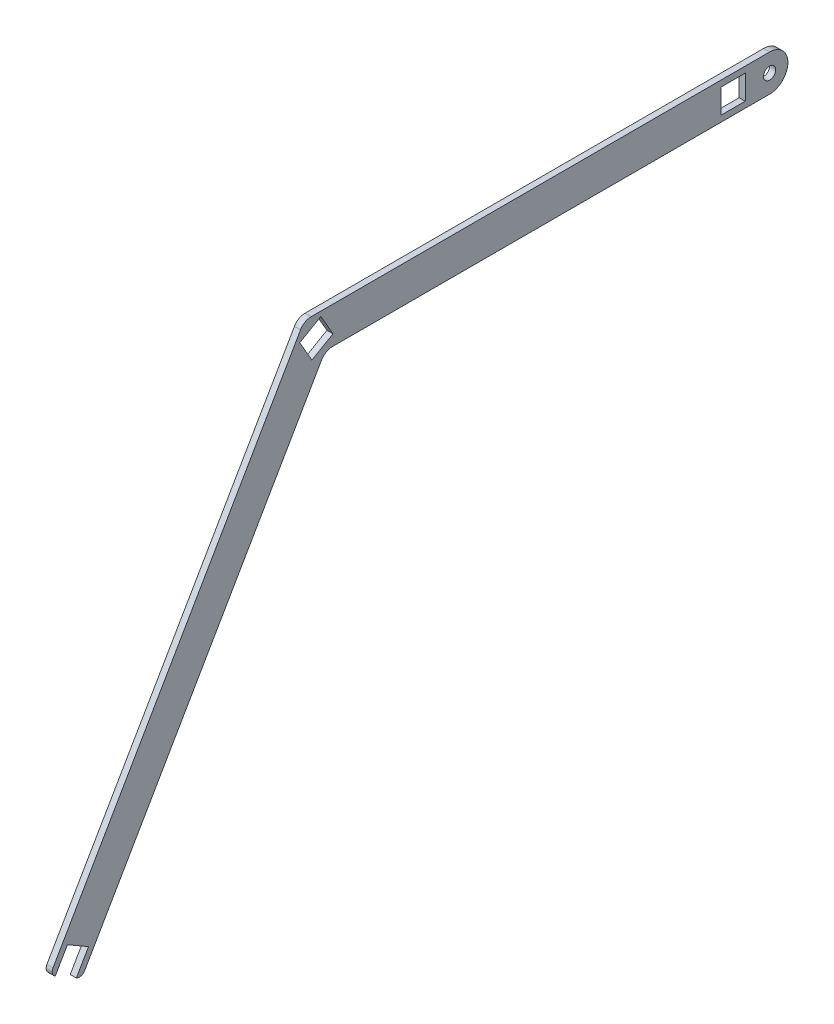
ISO-10303-21;
HEADER;
FILE_DESCRIPTION(('STEP AP214'),'2;1');
FILE_NAME('part.step','',(''),(''),'','','');
FILE_SCHEMA(('AUTOMOTIVE_DESIGN { 1 0 10303 214 1 1 1 1 }'));
ENDSEC;
DATA;
#1=APPLICATION_CONTEXT('core data for automotive mechanical design processes');
#2=APPLICATION_PROTOCOL_DEFINITION('international standard','automotive_design',2000,#1);
#3=PRODUCT_CONTEXT('',#1,'mechanical');
#4=PRODUCT('Part','Part','',(#3));
#5=PRODUCT_RELATED_PRODUCT_CATEGORY('part','',(#4));
#6=PRODUCT_DEFINITION_FORMATION('','',#4);
#7=PRODUCT_DEFINITION_CONTEXT('part definition',#1,'design');
#8=PRODUCT_DEFINITION('design','',#6,#7);
#9=PRODUCT_DEFINITION_SHAPE('','',#8);
#10=(LENGTH_UNIT() NAMED_UNIT(*) SI_UNIT(.MILLI.,.METRE.));
#11=(NAMED_UNIT(*) PLANE_ANGLE_UNIT() SI_UNIT($,.RADIAN.));
#12=(NAMED_UNIT(*) SI_UNIT($,.STERADIAN.) SOLID_ANGLE_UNIT());
#13=UNCERTAINTY_MEASURE_WITH_UNIT(LENGTH_MEASURE(1.E-05),#10,'distance_accuracy_value','');
#14=(GEOMETRIC_REPRESENTATION_CONTEXT(3) GLOBAL_UNCERTAINTY_ASSIGNED_CONTEXT((#13)) GLOBAL_UNIT_ASSIGNED_CONTEXT((#10,
#11,#12)) REPRESENTATION_CONTEXT('',''));
#15=CARTESIAN_POINT('',(0.,0.,0.));
#16=DIRECTION('',(0.,0.,1.));
#17=DIRECTION('',(1.,0.,0.));
#18=AXIS2_PLACEMENT_3D('',#15,#16,#17);
#19=CARTESIAN_POINT('',(10.,0.,0.));
#20=DIRECTION('',(-1.,0.,0.));
#21=DIRECTION('',(0.,0.,1.));
#22=AXIS2_PLACEMENT_3D('',#19,#20,#21);
#23=PLANE('',#22);
#24=DIRECTION('',(0.,1.,0.));
#25=VECTOR('',#24,1.);
#26=CARTESIAN_POINT('',(10.,20.,40.));
#27=LINE('',#26,#25);
#28=CARTESIAN_POINT('',(10.,-20.,40.));
#29=VERTEX_POINT('',#28);
#30=CARTESIAN_POINT('',(10.,20.,40.));
#31=VERTEX_POINT('',#30);
#32=EDGE_CURVE('E211',#29,#31,#27,.T.);
#33=ORIENTED_EDGE('',*,*,#32,.F.);
#34=DIRECTION('',(0.,0.,-1.));
#35=VECTOR('',#34,1.);
#36=CARTESIAN_POINT('',(10.,-20.,40.));
#37=LINE('',#36,#35);
#38=CARTESIAN_POINT('',(10.,-20.,80.));
#39=VERTEX_POINT('',#38);
#40=EDGE_CURVE('E219',#39,#29,#37,.T.);
#41=ORIENTED_EDGE('',*,*,#40,.F.);
#42=DIRECTION('',(0.,-1.,0.));
#43=VECTOR('',#42,1.);
#44=CARTESIAN_POINT('',(10.,20.,80.));
#45=LINE('',#44,#43);
#46=CARTESIAN_POINT('',(10.,20.,80.));
#47=VERTEX_POINT('',#46);
#48=EDGE_CURVE('E216',#47,#39,#45,.T.);
#49=ORIENTED_EDGE('',*,*,#48,.F.);
#50=DIRECTION('',(0.,0.,1.));
#51=VECTOR('',#50,1.);
#52=CARTESIAN_POINT('',(10.,20.,40.));
#53=LINE('',#52,#51);
#54=EDGE_CURVE('E213',#31,#47,#53,.T.);
#55=ORIENTED_EDGE('',*,*,#54,.F.);
#56=EDGE_LOOP('',(#33,#41,#49,#55));
#57=FACE_BOUND('',#56,.T.);
#58=DIRECTION('',(0.,0.,1.));
#59=VECTOR('',#58,1.);
#60=CARTESIAN_POINT('',(10.,30.,0.));
#61=LINE('',#60,#59);
#62=CARTESIAN_POINT('',(10.,30.,0.));
#63=VERTEX_POINT('',#62);
#64=CARTESIAN_POINT('',(10.,29.9999999999999,753.094010767585));
#65=VERTEX_POINT('',#64);
#66=EDGE_CURVE('E251',#63,#65,#61,.T.);
#67=ORIENTED_EDGE('',*,*,#66,.T.);
#68=CARTESIAN_POINT('',(10.,9.9999999999999,753.094010767585));
#69=DIRECTION('',(-1.,0.,0.));
#70=DIRECTION('',(0.,0.,1.));
#71=AXIS2_PLACEMENT_3D('',#68,#69,#70);
#72=CIRCLE('',#71,20.);
#73=CARTESIAN_POINT('',(10.,19.9999999999999,770.414518843274));
#74=VERTEX_POINT('',#73);
#75=EDGE_CURVE('E327',#65,#74,#72,.F.);
#76=ORIENTED_EDGE('',*,*,#75,.T.);
#77=DIRECTION('',(0.,-0.86602540378444,0.499999999999998));
#78=VECTOR('',#77,1.);
#79=CARTESIAN_POINT('',(10.,29.9999999999999,764.641016151378));
#80=LINE('',#79,#78);
#81=CARTESIAN_POINT('',(10.,-684.160068989707,1176.96152422706));
#82=VERTEX_POINT('',#81);
#83=EDGE_CURVE('E254',#74,#82,#80,.T.);
#84=ORIENTED_EDGE('',*,*,#83,.T.);
#85=CARTESIAN_POINT('',(10.,-689.160068989707,1168.30127018922));
#86=DIRECTION('',(-1.,0.,0.));
#87=DIRECTION('',(0.,0.,1.));
#88=AXIS2_PLACEMENT_3D('',#85,#86,#87);
#89=CIRCLE('',#88,10.);
#90=CARTESIAN_POINT('',(10.,-697.820323027552,1173.30127018922));
#91=VERTEX_POINT('',#90);
#92=EDGE_CURVE('E312',#82,#91,#89,.F.);
#93=ORIENTED_EDGE('',*,*,#92,.T.);
#94=DIRECTION('',(0.,0.866025403784439,-0.499999999999999));
#95=VECTOR('',#94,1.);
#96=CARTESIAN_POINT('',(10.,-697.820323027552,1173.30127018922));
#97=LINE('',#96,#95);
#98=CARTESIAN_POINT('',(10.,-663.179306876175,1153.30127018922));
#99=VERTEX_POINT('',#98);
#100=EDGE_CURVE('E256',#91,#99,#97,.T.);
#101=ORIENTED_EDGE('',*,*,#100,.T.);
#102=DIRECTION('',(0.,-0.500000000000005,-0.866025403784436));
#103=VECTOR('',#102,1.);
#104=CARTESIAN_POINT('',(10.,-663.179306876175,1153.30127018922));
#105=LINE('',#104,#103);
#106=CARTESIAN_POINT('',(10.,-683.179306876175,1118.66025403784));
#107=VERTEX_POINT('',#106);
#108=EDGE_CURVE('E258',#99,#107,#105,.T.);
#109=ORIENTED_EDGE('',*,*,#108,.T.);
#110=DIRECTION('',(0.,-0.866025403784438,0.5));
#111=VECTOR('',#110,1.);
#112=CARTESIAN_POINT('',(10.,-683.179306876175,1118.66025403784));
#113=LINE('',#112,#111);
#114=CARTESIAN_POINT('',(10.,-717.820323027552,1138.66025403784));
#115=VERTEX_POINT('',#114);
#116=EDGE_CURVE('E260',#107,#115,#113,.T.);
#117=ORIENTED_EDGE('',*,*,#116,.T.);
#118=CARTESIAN_POINT('',(10.,-709.160068989707,1133.66025403784));
#119=DIRECTION('',(-1.,0.,0.));
#120=DIRECTION('',(0.,0.,1.));
#121=AXIS2_PLACEMENT_3D('',#118,#119,#120);
#122=CIRCLE('',#121,10.);
#123=CARTESIAN_POINT('',(10.,-714.160068989707,1125.));
#124=VERTEX_POINT('',#123);
#125=EDGE_CURVE('E310',#115,#124,#122,.F.);
#126=ORIENTED_EDGE('',*,*,#125,.T.);
#127=DIRECTION('',(0.,0.86602540378444,-0.499999999999998));
#128=VECTOR('',#127,1.);
#129=CARTESIAN_POINT('',(10.,-722.820323027552,1130.));
#130=LINE('',#129,#128);
#131=CARTESIAN_POINT('',(10.,-39.9999999999998,735.773502691896));
#132=VERTEX_POINT('',#131);
#133=EDGE_CURVE('E262',#124,#132,#130,.T.);
#134=ORIENTED_EDGE('',*,*,#133,.T.);
#135=CARTESIAN_POINT('',(10.,-50.,718.452994616207));
#136=DIRECTION('',(-1.,0.,0.));
#137=DIRECTION('',(0.,0.,1.));
#138=AXIS2_PLACEMENT_3D('',#135,#136,#137);
#139=CIRCLE('',#138,20.);
#140=CARTESIAN_POINT('',(10.,-30.,718.452994616207));
#141=VERTEX_POINT('',#140);
#142=EDGE_CURVE('E11',#132,#141,#139,.T.);
#143=ORIENTED_EDGE('',*,*,#142,.T.);
#144=DIRECTION('',(0.,0.,-1.));
#145=VECTOR('',#144,1.);
#146=CARTESIAN_POINT('',(10.,-30.,730.));
#147=LINE('',#146,#145);
#148=CARTESIAN_POINT('',(10.,-30.,0.));
#149=VERTEX_POINT('',#148);
#150=EDGE_CURVE('E265',#141,#149,#147,.T.);
#151=ORIENTED_EDGE('',*,*,#150,.T.);
#152=CARTESIAN_POINT('',(10.,0.,0.));
#153=DIRECTION('',(1.,0.,0.));
#154=DIRECTION('',(0.,0.,1.));
#155=AXIS2_PLACEMENT_3D('',#152,#153,#154);
#156=CIRCLE('',#155,30.);
#157=EDGE_CURVE('E248',#149,#63,#156,.T.);
#158=ORIENTED_EDGE('',*,*,#157,.T.);
#159=EDGE_LOOP('',(#67,#76,#84,#93,#101,#109,#117,#126,#134,#143,#151,#158));
#160=FACE_BOUND('',#159,.T.);
#161=CARTESIAN_POINT('',(10.,0.,0.));
#162=DIRECTION('',(1.,0.,0.));
#163=DIRECTION('',(0.,0.,-1.));
#164=AXIS2_PLACEMENT_3D('',#161,#162,#163);
#165=CIRCLE('',#164,10.);
#166=CARTESIAN_POINT('',(10.,0.,-10.));
#167=VERTEX_POINT('',#166);
#168=EDGE_CURVE('E242',#167,#167,#165,.T.);
#169=ORIENTED_EDGE('',*,*,#168,.F.);
#170=EDGE_LOOP('',(#169));
#171=FACE_BOUND('',#170,.T.);
#172=DIRECTION('',(0.,-0.866025403784437,-0.500000000000004));
#173=VECTOR('',#172,1.);
#174=CARTESIAN_POINT('',(10.,2.32050807569054,771.754264805431));
#175=LINE('',#174,#173);
#176=CARTESIAN_POINT('',(10.,2.32050807569054,771.754264805431));
#177=VERTEX_POINT('',#176);
#178=CARTESIAN_POINT('',(10.,-32.3205080756869,751.754264805431));
#179=VERTEX_POINT('',#178);
#180=EDGE_CURVE('E170',#177,#179,#175,.T.);
#181=ORIENTED_EDGE('',*,*,#180,.F.);
#182=DIRECTION('',(0.,-0.500000000000004,0.866025403784436));
#183=VECTOR('',#182,1.);
#184=CARTESIAN_POINT('',(10.,22.3205080756907,737.113248654053));
#185=LINE('',#184,#183);
#186=CARTESIAN_POINT('',(10.,22.3205080756907,737.113248654053));
#187=VERTEX_POINT('',#186);
#188=EDGE_CURVE('E195',#187,#177,#185,.T.);
#189=ORIENTED_EDGE('',*,*,#188,.F.);
#190=DIRECTION('',(0.,0.866025403784437,0.500000000000003));
#191=VECTOR('',#190,1.);
#192=CARTESIAN_POINT('',(10.,-12.3205080756868,717.113248654053));
#193=LINE('',#192,#191);
#194=CARTESIAN_POINT('',(10.,-12.3205080756868,717.113248654053));
#195=VERTEX_POINT('',#194);
#196=EDGE_CURVE('E193',#195,#187,#193,.T.);
#197=ORIENTED_EDGE('',*,*,#196,.F.);
#198=DIRECTION('',(0.,0.500000000000004,-0.866025403784436));
#199=VECTOR('',#198,1.);
#200=CARTESIAN_POINT('',(10.,-32.3205080756869,751.754264805431));
#201=LINE('',#200,#199);
#202=EDGE_CURVE('E180',#179,#195,#201,.T.);
#203=ORIENTED_EDGE('',*,*,#202,.F.);
#204=EDGE_LOOP('',(#181,#189,#197,#203));
#205=FACE_BOUND('',#204,.T.);
#206=ADVANCED_FACE('F33',(#57,#160,#171,#205),#23,.F.);
#207=CARTESIAN_POINT('',(0.,0.,0.));
#208=DIRECTION('',(-1.,0.,0.));
#209=DIRECTION('',(0.,0.,1.));
#210=AXIS2_PLACEMENT_3D('',#207,#208,#209);
#211=PLANE('',#210);
#212=DIRECTION('',(0.,0.,-1.));
#213=VECTOR('',#212,1.);
#214=CARTESIAN_POINT('',(0.,-20.,40.));
#215=LINE('',#214,#213);
#216=CARTESIAN_POINT('',(0.,-20.,80.));
#217=VERTEX_POINT('',#216);
#218=CARTESIAN_POINT('',(0.,-20.,40.));
#219=VERTEX_POINT('',#218);
#220=EDGE_CURVE('E214',#217,#219,#215,.T.);
#221=ORIENTED_EDGE('',*,*,#220,.T.);
#222=DIRECTION('',(0.,1.,0.));
#223=VECTOR('',#222,1.);
#224=CARTESIAN_POINT('',(0.,20.,40.));
#225=LINE('',#224,#223);
#226=CARTESIAN_POINT('',(0.,20.,40.));
#227=VERTEX_POINT('',#226);
#228=EDGE_CURVE('E188',#219,#227,#225,.T.);
#229=ORIENTED_EDGE('',*,*,#228,.T.);
#230=DIRECTION('',(0.,0.,1.));
#231=VECTOR('',#230,1.);
#232=CARTESIAN_POINT('',(0.,20.,40.));
#233=LINE('',#232,#231);
#234=CARTESIAN_POINT('',(0.,20.,80.));
#235=VERTEX_POINT('',#234);
#236=EDGE_CURVE('E224',#227,#235,#233,.T.);
#237=ORIENTED_EDGE('',*,*,#236,.T.);
#238=DIRECTION('',(0.,-1.,0.));
#239=VECTOR('',#238,1.);
#240=CARTESIAN_POINT('',(0.,20.,80.));
#241=LINE('',#240,#239);
#242=EDGE_CURVE('E227',#235,#217,#241,.T.);
#243=ORIENTED_EDGE('',*,*,#242,.T.);
#244=EDGE_LOOP('',(#221,#229,#237,#243));
#245=FACE_BOUND('',#244,.T.);
#246=DIRECTION('',(0.,-0.86602540378444,0.499999999999998));
#247=VECTOR('',#246,1.);
#248=CARTESIAN_POINT('',(0.,29.9999999999999,764.641016151378));
#249=LINE('',#248,#247);
#250=CARTESIAN_POINT('',(0.,19.9999999999999,770.414518843274));
#251=VERTEX_POINT('',#250);
#252=CARTESIAN_POINT('',(0.,-684.160068989707,1176.96152422706));
#253=VERTEX_POINT('',#252);
#254=EDGE_CURVE('E272',#251,#253,#249,.T.);
#255=ORIENTED_EDGE('',*,*,#254,.F.);
#256=CARTESIAN_POINT('',(0.,9.9999999999999,753.094010767585));
#257=DIRECTION('',(-1.,0.,0.));
#258=DIRECTION('',(0.,0.,1.));
#259=AXIS2_PLACEMENT_3D('',#256,#257,#258);
#260=CIRCLE('',#259,20.);
#261=CARTESIAN_POINT('',(0.,29.9999999999999,753.094010767585));
#262=VERTEX_POINT('',#261);
#263=EDGE_CURVE('E56',#251,#262,#260,.T.);
#264=ORIENTED_EDGE('',*,*,#263,.T.);
#265=DIRECTION('',(0.,0.,1.));
#266=VECTOR('',#265,1.);
#267=CARTESIAN_POINT('',(0.,30.,0.));
#268=LINE('',#267,#266);
#269=CARTESIAN_POINT('',(0.,30.,0.));
#270=VERTEX_POINT('',#269);
#271=EDGE_CURVE('E270',#270,#262,#268,.T.);
#272=ORIENTED_EDGE('',*,*,#271,.F.);
#273=CARTESIAN_POINT('',(0.,0.,0.));
#274=DIRECTION('',(1.,0.,0.));
#275=DIRECTION('',(0.,0.,1.));
#276=AXIS2_PLACEMENT_3D('',#273,#274,#275);
#277=CIRCLE('',#276,30.);
#278=CARTESIAN_POINT('',(0.,-30.,0.));
#279=VERTEX_POINT('',#278);
#280=EDGE_CURVE('E245',#279,#270,#277,.T.);
#281=ORIENTED_EDGE('',*,*,#280,.F.);
#282=DIRECTION('',(0.,0.,-1.));
#283=VECTOR('',#282,1.);
#284=CARTESIAN_POINT('',(0.,-30.,730.));
#285=LINE('',#284,#283);
#286=CARTESIAN_POINT('',(0.,-30.,718.452994616207));
#287=VERTEX_POINT('',#286);
#288=EDGE_CURVE('E252',#287,#279,#285,.T.);
#289=ORIENTED_EDGE('',*,*,#288,.F.);
#290=CARTESIAN_POINT('',(0.,-50.,718.452994616207));
#291=DIRECTION('',(-1.,0.,0.));
#292=DIRECTION('',(0.,0.,1.));
#293=AXIS2_PLACEMENT_3D('',#290,#291,#292);
#294=CIRCLE('',#293,20.);
#295=CARTESIAN_POINT('',(0.,-39.9999999999998,735.773502691896));
#296=VERTEX_POINT('',#295);
#297=EDGE_CURVE('E41',#287,#296,#294,.F.);
#298=ORIENTED_EDGE('',*,*,#297,.T.);
#299=DIRECTION('',(0.,0.86602540378444,-0.499999999999998));
#300=VECTOR('',#299,1.);
#301=CARTESIAN_POINT('',(0.,-722.820323027552,1130.));
#302=LINE('',#301,#300);
#303=CARTESIAN_POINT('',(0.,-714.160068989707,1125.));
#304=VERTEX_POINT('',#303);
#305=EDGE_CURVE('E281',#304,#296,#302,.T.);
#306=ORIENTED_EDGE('',*,*,#305,.F.);
#307=CARTESIAN_POINT('',(0.,-709.160068989707,1133.66025403784));
#308=DIRECTION('',(-1.,0.,0.));
#309=DIRECTION('',(0.,0.,1.));
#310=AXIS2_PLACEMENT_3D('',#307,#308,#309);
#311=CIRCLE('',#310,10.);
#312=CARTESIAN_POINT('',(0.,-717.820323027552,1138.66025403784));
#313=VERTEX_POINT('',#312);
#314=EDGE_CURVE('E302',#304,#313,#311,.T.);
#315=ORIENTED_EDGE('',*,*,#314,.T.);
#316=DIRECTION('',(0.,-0.866025403784438,0.5));
#317=VECTOR('',#316,1.);
#318=CARTESIAN_POINT('',(0.,-683.179306876175,1118.66025403784));
#319=LINE('',#318,#317);
#320=CARTESIAN_POINT('',(0.,-683.179306876175,1118.66025403784));
#321=VERTEX_POINT('',#320);
#322=EDGE_CURVE('E278',#321,#313,#319,.T.);
#323=ORIENTED_EDGE('',*,*,#322,.F.);
#324=DIRECTION('',(0.,-0.500000000000005,-0.866025403784436));
#325=VECTOR('',#324,1.);
#326=CARTESIAN_POINT('',(0.,-663.179306876175,1153.30127018922));
#327=LINE('',#326,#325);
#328=CARTESIAN_POINT('',(0.,-663.179306876175,1153.30127018922));
#329=VERTEX_POINT('',#328);
#330=EDGE_CURVE('E276',#329,#321,#327,.T.);
#331=ORIENTED_EDGE('',*,*,#330,.F.);
#332=DIRECTION('',(0.,0.866025403784439,-0.499999999999999));
#333=VECTOR('',#332,1.);
#334=CARTESIAN_POINT('',(0.,-697.820323027552,1173.30127018922));
#335=LINE('',#334,#333);
#336=CARTESIAN_POINT('',(0.,-697.820323027552,1173.30127018922));
#337=VERTEX_POINT('',#336);
#338=EDGE_CURVE('E274',#337,#329,#335,.T.);
#339=ORIENTED_EDGE('',*,*,#338,.F.);
#340=CARTESIAN_POINT('',(0.,-689.160068989707,1168.30127018922));
#341=DIRECTION('',(-1.,0.,0.));
#342=DIRECTION('',(0.,0.,1.));
#343=AXIS2_PLACEMENT_3D('',#340,#341,#342);
#344=CIRCLE('',#343,10.);
#345=EDGE_CURVE('E304',#337,#253,#344,.T.);
#346=ORIENTED_EDGE('',*,*,#345,.T.);
#347=EDGE_LOOP('',(#255,#264,#272,#281,#289,#298,#306,#315,#323,#331,#339,#346));
#348=FACE_BOUND('',#347,.T.);
#349=CARTESIAN_POINT('',(0.,0.,0.));
#350=DIRECTION('',(1.,0.,0.));
#351=DIRECTION('',(0.,0.,-1.));
#352=AXIS2_PLACEMENT_3D('',#349,#350,#351);
#353=CIRCLE('',#352,10.);
#354=CARTESIAN_POINT('',(0.,0.,-10.));
#355=VERTEX_POINT('',#354);
#356=EDGE_CURVE('E241',#355,#355,#353,.T.);
#357=ORIENTED_EDGE('',*,*,#356,.T.);
#358=EDGE_LOOP('',(#357));
#359=FACE_BOUND('',#358,.T.);
#360=DIRECTION('',(0.,-0.500000000000004,0.866025403784436));
#361=VECTOR('',#360,1.);
#362=CARTESIAN_POINT('',(0.,22.3205080756907,737.113248654053));
#363=LINE('',#362,#361);
#364=CARTESIAN_POINT('',(0.,22.3205080756907,737.113248654053));
#365=VERTEX_POINT('',#364);
#366=CARTESIAN_POINT('',(0.,2.32050807569045,771.754264805431));
#367=VERTEX_POINT('',#366);
#368=EDGE_CURVE('E181',#365,#367,#363,.T.);
#369=ORIENTED_EDGE('',*,*,#368,.T.);
#370=DIRECTION('',(0.,-0.866025403784437,-0.500000000000004));
#371=VECTOR('',#370,1.);
#372=CARTESIAN_POINT('',(0.,2.32050807569054,771.754264805431));
#373=LINE('',#372,#371);
#374=CARTESIAN_POINT('',(0.,-32.3205080756869,751.754264805431));
#375=VERTEX_POINT('',#374);
#376=EDGE_CURVE('E199',#367,#375,#373,.T.);
#377=ORIENTED_EDGE('',*,*,#376,.T.);
#378=DIRECTION('',(0.,0.500000000000004,-0.866025403784436));
#379=VECTOR('',#378,1.);
#380=CARTESIAN_POINT('',(0.,-32.3205080756869,751.754264805431));
#381=LINE('',#380,#379);
#382=CARTESIAN_POINT('',(0.,-12.3205080756868,717.113248654053));
#383=VERTEX_POINT('',#382);
#384=EDGE_CURVE('E187',#375,#383,#381,.T.);
#385=ORIENTED_EDGE('',*,*,#384,.T.);
#386=DIRECTION('',(0.,0.866025403784437,0.500000000000003));
#387=VECTOR('',#386,1.);
#388=CARTESIAN_POINT('',(0.,-12.3205080756868,717.113248654053));
#389=LINE('',#388,#387);
#390=EDGE_CURVE('E202',#383,#365,#389,.T.);
#391=ORIENTED_EDGE('',*,*,#390,.T.);
#392=EDGE_LOOP('',(#369,#377,#385,#391));
#393=FACE_BOUND('',#392,.T.);
#394=ADVANCED_FACE('F330',(#245,#348,#359,#393),#211,.T.);
#395=CARTESIAN_POINT('',(10.,0.,0.));
#396=DIRECTION('',(-1.,0.,0.));
#397=DIRECTION('',(0.,0.,1.));
#398=AXIS2_PLACEMENT_3D('',#395,#396,#397);
#399=CYLINDRICAL_SURFACE('',#398,30.);
#400=ORIENTED_EDGE('',*,*,#280,.T.);
#401=DIRECTION('',(-1.,0.,0.));
#402=VECTOR('',#401,1.);
#403=CARTESIAN_POINT('',(10.,30.,0.));
#404=LINE('',#403,#402);
#405=EDGE_CURVE('E299',#63,#270,#404,.T.);
#406=ORIENTED_EDGE('',*,*,#405,.F.);
#407=ORIENTED_EDGE('',*,*,#157,.F.);
#408=DIRECTION('',(-1.,0.,0.));
#409=VECTOR('',#408,1.);
#410=CARTESIAN_POINT('',(10.,-30.,0.));
#411=LINE('',#410,#409);
#412=EDGE_CURVE('E267',#149,#279,#411,.T.);
#413=ORIENTED_EDGE('',*,*,#412,.T.);
#414=EDGE_LOOP('',(#400,#406,#407,#413));
#415=FACE_BOUND('',#414,.T.);
#416=ADVANCED_FACE('F351',(#415),#399,.T.);
#417=CARTESIAN_POINT('',(10.,30.,0.));
#418=DIRECTION('',(0.,-1.,0.));
#419=DIRECTION('',(0.,0.,-1.));
#420=AXIS2_PLACEMENT_3D('',#417,#418,#419);
#421=PLANE('',#420);
#422=ORIENTED_EDGE('',*,*,#271,.T.);
#423=DIRECTION('',(-1.,0.,0.));
#424=VECTOR('',#423,1.);
#425=CARTESIAN_POINT('',(10.,29.9999999999999,753.094010767585));
#426=LINE('',#425,#424);
#427=EDGE_CURVE('E48',#262,#65,#426,.F.);
#428=ORIENTED_EDGE('',*,*,#427,.T.);
#429=ORIENTED_EDGE('',*,*,#66,.F.);
#430=ORIENTED_EDGE('',*,*,#405,.T.);
#431=EDGE_LOOP('',(#422,#428,#429,#430));
#432=FACE_BOUND('',#431,.T.);
#433=ADVANCED_FACE('F414',(#432),#421,.F.);
#434=CARTESIAN_POINT('',(10.,29.9999999999999,764.641016151378));
#435=DIRECTION('',(0.,-0.499999999999998,-0.86602540378444));
#436=DIRECTION('',(0.,0.86602540378444,-0.499999999999998));
#437=AXIS2_PLACEMENT_3D('',#434,#435,#436);
#438=PLANE('',#437);
#439=ORIENTED_EDGE('',*,*,#83,.F.);
#440=DIRECTION('',(-1.,0.,0.));
#441=VECTOR('',#440,1.);
#442=CARTESIAN_POINT('',(10.,19.9999999999999,770.414518843274));
#443=LINE('',#442,#441);
#444=EDGE_CURVE('E322',#74,#251,#443,.T.);
#445=ORIENTED_EDGE('',*,*,#444,.T.);
#446=ORIENTED_EDGE('',*,*,#254,.T.);
#447=DIRECTION('',(-1.,0.,0.));
#448=VECTOR('',#447,1.);
#449=CARTESIAN_POINT('',(10.,-684.160068989707,1176.96152422706));
#450=LINE('',#449,#448);
#451=EDGE_CURVE('E307',#253,#82,#450,.F.);
#452=ORIENTED_EDGE('',*,*,#451,.T.);
#453=EDGE_LOOP('',(#439,#445,#446,#452));
#454=FACE_BOUND('',#453,.T.);
#455=ADVANCED_FACE('F357',(#454),#438,.F.);
#456=CARTESIAN_POINT('',(10.,-697.820323027552,1173.30127018922));
#457=DIRECTION('',(0.,0.499999999999999,0.866025403784439));
#458=DIRECTION('',(0.,-0.866025403784439,0.499999999999999));
#459=AXIS2_PLACEMENT_3D('',#456,#457,#458);
#460=PLANE('',#459);
#461=ORIENTED_EDGE('',*,*,#338,.T.);
#462=DIRECTION('',(-1.,0.,0.));
#463=VECTOR('',#462,1.);
#464=CARTESIAN_POINT('',(10.,-663.179306876175,1153.30127018922));
#465=LINE('',#464,#463);
#466=EDGE_CURVE('E293',#99,#329,#465,.T.);
#467=ORIENTED_EDGE('',*,*,#466,.F.);
#468=ORIENTED_EDGE('',*,*,#100,.F.);
#469=DIRECTION('',(-1.,0.,0.));
#470=VECTOR('',#469,1.);
#471=CARTESIAN_POINT('',(10.,-697.820323027552,1173.30127018922));
#472=LINE('',#471,#470);
#473=EDGE_CURVE('E296',#91,#337,#472,.T.);
#474=ORIENTED_EDGE('',*,*,#473,.T.);
#475=EDGE_LOOP('',(#461,#467,#468,#474));
#476=FACE_BOUND('',#475,.T.);
#477=ADVANCED_FACE('F368',(#476),#460,.F.);
#478=CARTESIAN_POINT('',(10.,-663.179306876175,1153.30127018922));
#479=DIRECTION('',(0.,0.866025403784436,-0.500000000000005));
#480=DIRECTION('',(0.,0.500000000000005,0.866025403784436));
#481=AXIS2_PLACEMENT_3D('',#478,#479,#480);
#482=PLANE('',#481);
#483=ORIENTED_EDGE('',*,*,#330,.T.);
#484=DIRECTION('',(-1.,0.,0.));
#485=VECTOR('',#484,1.);
#486=CARTESIAN_POINT('',(10.,-683.179306876175,1118.66025403784));
#487=LINE('',#486,#485);
#488=EDGE_CURVE('E290',#107,#321,#487,.T.);
#489=ORIENTED_EDGE('',*,*,#488,.F.);
#490=ORIENTED_EDGE('',*,*,#108,.F.);
#491=ORIENTED_EDGE('',*,*,#466,.T.);
#492=EDGE_LOOP('',(#483,#489,#490,#491));
#493=FACE_BOUND('',#492,.T.);
#494=ADVANCED_FACE('F372',(#493),#482,.F.);
#495=CARTESIAN_POINT('',(10.,-683.179306876175,1118.66025403784));
#496=DIRECTION('',(0.,-0.5,-0.866025403784438));
#497=DIRECTION('',(0.,0.866025403784438,-0.5));
#498=AXIS2_PLACEMENT_3D('',#495,#496,#497);
#499=PLANE('',#498);
#500=ORIENTED_EDGE('',*,*,#322,.T.);
#501=DIRECTION('',(-1.,0.,0.));
#502=VECTOR('',#501,1.);
#503=CARTESIAN_POINT('',(10.,-717.820323027552,1138.66025403784));
#504=LINE('',#503,#502);
#505=EDGE_CURVE('E287',#115,#313,#504,.T.);
#506=ORIENTED_EDGE('',*,*,#505,.F.);
#507=ORIENTED_EDGE('',*,*,#116,.F.);
#508=ORIENTED_EDGE('',*,*,#488,.T.);
#509=EDGE_LOOP('',(#500,#506,#507,#508));
#510=FACE_BOUND('',#509,.T.);
#511=ADVANCED_FACE('F377',(#510),#499,.F.);
#512=CARTESIAN_POINT('',(10.,-722.820323027552,1130.));
#513=DIRECTION('',(0.,0.499999999999998,0.86602540378444));
#514=DIRECTION('',(0.,-0.86602540378444,0.499999999999998));
#515=AXIS2_PLACEMENT_3D('',#512,#513,#514);
#516=PLANE('',#515);
#517=ORIENTED_EDGE('',*,*,#305,.T.);
#518=DIRECTION('',(-1.,0.,0.));
#519=VECTOR('',#518,1.);
#520=CARTESIAN_POINT('',(10.,-40.,735.773502691896));
#521=LINE('',#520,#519);
#522=EDGE_CURVE('E320',#296,#132,#521,.F.);
#523=ORIENTED_EDGE('',*,*,#522,.T.);
#524=ORIENTED_EDGE('',*,*,#133,.F.);
#525=DIRECTION('',(-1.,0.,0.));
#526=VECTOR('',#525,1.);
#527=CARTESIAN_POINT('',(10.,-714.160068989707,1125.));
#528=LINE('',#527,#526);
#529=EDGE_CURVE('E314',#124,#304,#528,.T.);
#530=ORIENTED_EDGE('',*,*,#529,.T.);
#531=EDGE_LOOP('',(#517,#523,#524,#530));
#532=FACE_BOUND('',#531,.T.);
#533=ADVANCED_FACE('F337',(#532),#516,.F.);
#534=CARTESIAN_POINT('',(10.,-30.,730.));
#535=DIRECTION('',(0.,1.,0.));
#536=DIRECTION('',(0.,0.,1.));
#537=AXIS2_PLACEMENT_3D('',#534,#535,#536);
#538=PLANE('',#537);
#539=ORIENTED_EDGE('',*,*,#150,.F.);
#540=DIRECTION('',(-1.,0.,0.));
#541=VECTOR('',#540,1.);
#542=CARTESIAN_POINT('',(0.,-30.,718.452994616207));
#543=LINE('',#542,#541);
#544=EDGE_CURVE('E317',#141,#287,#543,.T.);
#545=ORIENTED_EDGE('',*,*,#544,.T.);
#546=ORIENTED_EDGE('',*,*,#288,.T.);
#547=ORIENTED_EDGE('',*,*,#412,.F.);
#548=EDGE_LOOP('',(#539,#545,#546,#547));
#549=FACE_BOUND('',#548,.T.);
#550=ADVANCED_FACE('F347',(#549),#538,.F.);
#551=CARTESIAN_POINT('',(10.,0.,0.));
#552=DIRECTION('',(-1.,0.,0.));
#553=DIRECTION('',(0.,0.,1.));
#554=AXIS2_PLACEMENT_3D('',#551,#552,#553);
#555=CYLINDRICAL_SURFACE('',#554,10.);
#556=ORIENTED_EDGE('',*,*,#168,.T.);
#557=EDGE_LOOP('',(#556));
#558=FACE_BOUND('',#557,.T.);
#559=ORIENTED_EDGE('',*,*,#356,.F.);
#560=EDGE_LOOP('',(#559));
#561=FACE_BOUND('',#560,.T.);
#562=ADVANCED_FACE('F399',(#558,#561),#555,.F.);
#563=CARTESIAN_POINT('',(10.,20.,40.));
#564=DIRECTION('',(0.,0.,1.));
#565=DIRECTION('',(0.,-1.,0.));
#566=AXIS2_PLACEMENT_3D('',#563,#564,#565);
#567=PLANE('',#566);
#568=ORIENTED_EDGE('',*,*,#228,.F.);
#569=DIRECTION('',(-1.,0.,0.));
#570=VECTOR('',#569,1.);
#571=CARTESIAN_POINT('',(10.,-20.,40.));
#572=LINE('',#571,#570);
#573=EDGE_CURVE('E221',#29,#219,#572,.T.);
#574=ORIENTED_EDGE('',*,*,#573,.F.);
#575=ORIENTED_EDGE('',*,*,#32,.T.);
#576=DIRECTION('',(-1.,0.,0.));
#577=VECTOR('',#576,1.);
#578=CARTESIAN_POINT('',(10.,20.,40.));
#579=LINE('',#578,#577);
#580=EDGE_CURVE('E238',#31,#227,#579,.T.);
#581=ORIENTED_EDGE('',*,*,#580,.T.);
#582=EDGE_LOOP('',(#568,#574,#575,#581));
#583=FACE_BOUND('',#582,.T.);
#584=ADVANCED_FACE('F459',(#583),#567,.T.);
#585=CARTESIAN_POINT('',(10.,20.,40.));
#586=DIRECTION('',(0.,-1.,0.));
#587=DIRECTION('',(0.,0.,-1.));
#588=AXIS2_PLACEMENT_3D('',#585,#586,#587);
#589=PLANE('',#588);
#590=ORIENTED_EDGE('',*,*,#236,.F.);
#591=ORIENTED_EDGE('',*,*,#580,.F.);
#592=ORIENTED_EDGE('',*,*,#54,.T.);
#593=DIRECTION('',(-1.,0.,0.));
#594=VECTOR('',#593,1.);
#595=CARTESIAN_POINT('',(10.,20.,80.));
#596=LINE('',#595,#594);
#597=EDGE_CURVE('E236',#47,#235,#596,.T.);
#598=ORIENTED_EDGE('',*,*,#597,.T.);
#599=EDGE_LOOP('',(#590,#591,#592,#598));
#600=FACE_BOUND('',#599,.T.);
#601=ADVANCED_FACE('F466',(#600),#589,.T.);
#602=CARTESIAN_POINT('',(10.,20.,80.));
#603=DIRECTION('',(0.,0.,-1.));
#604=DIRECTION('',(-1.,0.,0.));
#605=AXIS2_PLACEMENT_3D('',#602,#603,#604);
#606=PLANE('',#605);
#607=ORIENTED_EDGE('',*,*,#242,.F.);
#608=ORIENTED_EDGE('',*,*,#597,.F.);
#609=ORIENTED_EDGE('',*,*,#48,.T.);
#610=DIRECTION('',(-1.,0.,0.));
#611=VECTOR('',#610,1.);
#612=CARTESIAN_POINT('',(10.,-20.,80.));
#613=LINE('',#612,#611);
#614=EDGE_CURVE('E234',#39,#217,#613,.T.);
#615=ORIENTED_EDGE('',*,*,#614,.T.);
#616=EDGE_LOOP('',(#607,#608,#609,#615));
#617=FACE_BOUND('',#616,.T.);
#618=ADVANCED_FACE('F473',(#617),#606,.T.);
#619=CARTESIAN_POINT('',(10.,-20.,40.));
#620=DIRECTION('',(0.,1.,0.));
#621=DIRECTION('',(0.,0.,1.));
#622=AXIS2_PLACEMENT_3D('',#619,#620,#621);
#623=PLANE('',#622);
#624=ORIENTED_EDGE('',*,*,#220,.F.);
#625=ORIENTED_EDGE('',*,*,#614,.F.);
#626=ORIENTED_EDGE('',*,*,#40,.T.);
#627=ORIENTED_EDGE('',*,*,#573,.T.);
#628=EDGE_LOOP('',(#624,#625,#626,#627));
#629=FACE_BOUND('',#628,.T.);
#630=ADVANCED_FACE('F481',(#629),#623,.T.);
#631=CARTESIAN_POINT('',(10.,2.32050807569054,771.754264805431));
#632=DIRECTION('',(0.,0.500000000000004,-0.866025403784437));
#633=DIRECTION('',(0.,0.866025403784437,0.500000000000004));
#634=AXIS2_PLACEMENT_3D('',#631,#632,#633);
#635=PLANE('',#634);
#636=ORIENTED_EDGE('',*,*,#376,.F.);
#637=DIRECTION('',(-1.,0.,0.));
#638=VECTOR('',#637,1.);
#639=CARTESIAN_POINT('',(10.,2.32050807569054,771.754264805431));
#640=LINE('',#639,#638);
#641=EDGE_CURVE('E176',#177,#367,#640,.T.);
#642=ORIENTED_EDGE('',*,*,#641,.F.);
#643=ORIENTED_EDGE('',*,*,#180,.T.);
#644=DIRECTION('',(-1.,0.,0.));
#645=VECTOR('',#644,1.);
#646=CARTESIAN_POINT('',(10.,-32.3205080756869,751.754264805431));
#647=LINE('',#646,#645);
#648=EDGE_CURVE('E173',#179,#375,#647,.T.);
#649=ORIENTED_EDGE('',*,*,#648,.T.);
#650=EDGE_LOOP('',(#636,#642,#643,#649));
#651=FACE_BOUND('',#650,.T.);
#652=ADVANCED_FACE('F172',(#651),#635,.T.);
#653=CARTESIAN_POINT('',(10.,-32.3205080756869,751.754264805431));
#654=DIRECTION('',(0.,0.866025403784436,0.500000000000004));
#655=DIRECTION('',(0.,-0.500000000000004,0.866025403784436));
#656=AXIS2_PLACEMENT_3D('',#653,#654,#655);
#657=PLANE('',#656);
#658=ORIENTED_EDGE('',*,*,#384,.F.);
#659=ORIENTED_EDGE('',*,*,#648,.F.);
#660=ORIENTED_EDGE('',*,*,#202,.T.);
#661=DIRECTION('',(-1.,0.,0.));
#662=VECTOR('',#661,1.);
#663=CARTESIAN_POINT('',(10.,-12.3205080756868,717.113248654053));
#664=LINE('',#663,#662);
#665=EDGE_CURVE('E189',#195,#383,#664,.T.);
#666=ORIENTED_EDGE('',*,*,#665,.T.);
#667=EDGE_LOOP('',(#658,#659,#660,#666));
#668=FACE_BOUND('',#667,.T.);
#669=ADVANCED_FACE('F184',(#668),#657,.T.);
#670=CARTESIAN_POINT('',(10.,-12.3205080756868,717.113248654053));
#671=DIRECTION('',(0.,-0.500000000000003,0.866025403784437));
#672=DIRECTION('',(0.,-0.866025403784437,-0.500000000000003));
#673=AXIS2_PLACEMENT_3D('',#670,#671,#672);
#674=PLANE('',#673);
#675=ORIENTED_EDGE('',*,*,#390,.F.);
#676=ORIENTED_EDGE('',*,*,#665,.F.);
#677=ORIENTED_EDGE('',*,*,#196,.T.);
#678=DIRECTION('',(-1.,0.,0.));
#679=VECTOR('',#678,1.);
#680=CARTESIAN_POINT('',(10.,22.3205080756907,737.113248654053));
#681=LINE('',#680,#679);
#682=EDGE_CURVE('E208',#187,#365,#681,.T.);
#683=ORIENTED_EDGE('',*,*,#682,.T.);
#684=EDGE_LOOP('',(#675,#676,#677,#683));
#685=FACE_BOUND('',#684,.T.);
#686=ADVANCED_FACE('F502',(#685),#674,.T.);
#687=CARTESIAN_POINT('',(10.,22.3205080756907,737.113248654053));
#688=DIRECTION('',(0.,-0.866025403784436,-0.500000000000004));
#689=DIRECTION('',(0.,0.500000000000005,-0.866025403784436));
#690=AXIS2_PLACEMENT_3D('',#687,#688,#689);
#691=PLANE('',#690);
#692=ORIENTED_EDGE('',*,*,#368,.F.);
#693=ORIENTED_EDGE('',*,*,#682,.F.);
#694=ORIENTED_EDGE('',*,*,#188,.T.);
#695=ORIENTED_EDGE('',*,*,#641,.T.);
#696=EDGE_LOOP('',(#692,#693,#694,#695));
#697=FACE_BOUND('',#696,.T.);
#698=ADVANCED_FACE('F387',(#697),#691,.T.);
#699=CARTESIAN_POINT('',(10.,-689.160068989707,1168.30127018922));
#700=DIRECTION('',(-1.,0.,0.));
#701=DIRECTION('',(0.,0.,1.));
#702=AXIS2_PLACEMENT_3D('',#699,#700,#701);
#703=CYLINDRICAL_SURFACE('',#702,10.);
#704=ORIENTED_EDGE('',*,*,#92,.F.);
#705=ORIENTED_EDGE('',*,*,#451,.F.);
#706=ORIENTED_EDGE('',*,*,#345,.F.);
#707=ORIENTED_EDGE('',*,*,#473,.F.);
#708=EDGE_LOOP('',(#704,#705,#706,#707));
#709=FACE_BOUND('',#708,.T.);
#710=ADVANCED_FACE('F364',(#709),#703,.T.);
#711=CARTESIAN_POINT('',(10.,-709.160068989707,1133.66025403784));
#712=DIRECTION('',(-1.,0.,0.));
#713=DIRECTION('',(0.,0.,1.));
#714=AXIS2_PLACEMENT_3D('',#711,#712,#713);
#715=CYLINDRICAL_SURFACE('',#714,10.);
#716=ORIENTED_EDGE('',*,*,#125,.F.);
#717=ORIENTED_EDGE('',*,*,#505,.T.);
#718=ORIENTED_EDGE('',*,*,#314,.F.);
#719=ORIENTED_EDGE('',*,*,#529,.F.);
#720=EDGE_LOOP('',(#716,#717,#718,#719));
#721=FACE_BOUND('',#720,.T.);
#722=ADVANCED_FACE('F380',(#721),#715,.T.);
#723=CARTESIAN_POINT('',(10.,-50.,718.452994616207));
#724=DIRECTION('',(1.,0.,0.));
#725=DIRECTION('',(0.,0.,-1.));
#726=AXIS2_PLACEMENT_3D('',#723,#724,#725);
#727=CYLINDRICAL_SURFACE('',#726,20.);
#728=ORIENTED_EDGE('',*,*,#142,.F.);
#729=ORIENTED_EDGE('',*,*,#522,.F.);
#730=ORIENTED_EDGE('',*,*,#297,.F.);
#731=ORIENTED_EDGE('',*,*,#544,.F.);
#732=EDGE_LOOP('',(#728,#729,#730,#731));
#733=FACE_BOUND('',#732,.T.);
#734=ADVANCED_FACE('F341',(#733),#727,.F.);
#735=CARTESIAN_POINT('',(10.,9.9999999999999,753.094010767585));
#736=DIRECTION('',(-1.,0.,0.));
#737=DIRECTION('',(0.,0.,1.));
#738=AXIS2_PLACEMENT_3D('',#735,#736,#737);
#739=CYLINDRICAL_SURFACE('',#738,20.);
#740=ORIENTED_EDGE('',*,*,#75,.F.);
#741=ORIENTED_EDGE('',*,*,#427,.F.);
#742=ORIENTED_EDGE('',*,*,#263,.F.);
#743=ORIENTED_EDGE('',*,*,#444,.F.);
#744=EDGE_LOOP('',(#740,#741,#742,#743));
#745=FACE_BOUND('',#744,.T.);
#746=ADVANCED_FACE('F35',(#745),#739,.T.);
#747=CLOSED_SHELL('',(#206,#394,#416,#433,#455,#477,#494,#511,#533,#550,#562,#584,#601,#618,
#630,#652,#669,#686,#698,#710,#722,#734,#746));
#748=MANIFOLD_SOLID_BREP('B2',#747);
#749=ADVANCED_BREP_SHAPE_REPRESENTATION('',(#18,#748),#14);
#750=SHAPE_DEFINITION_REPRESENTATION(#9,#749);
ENDSEC;
END-ISO-10303-21;
